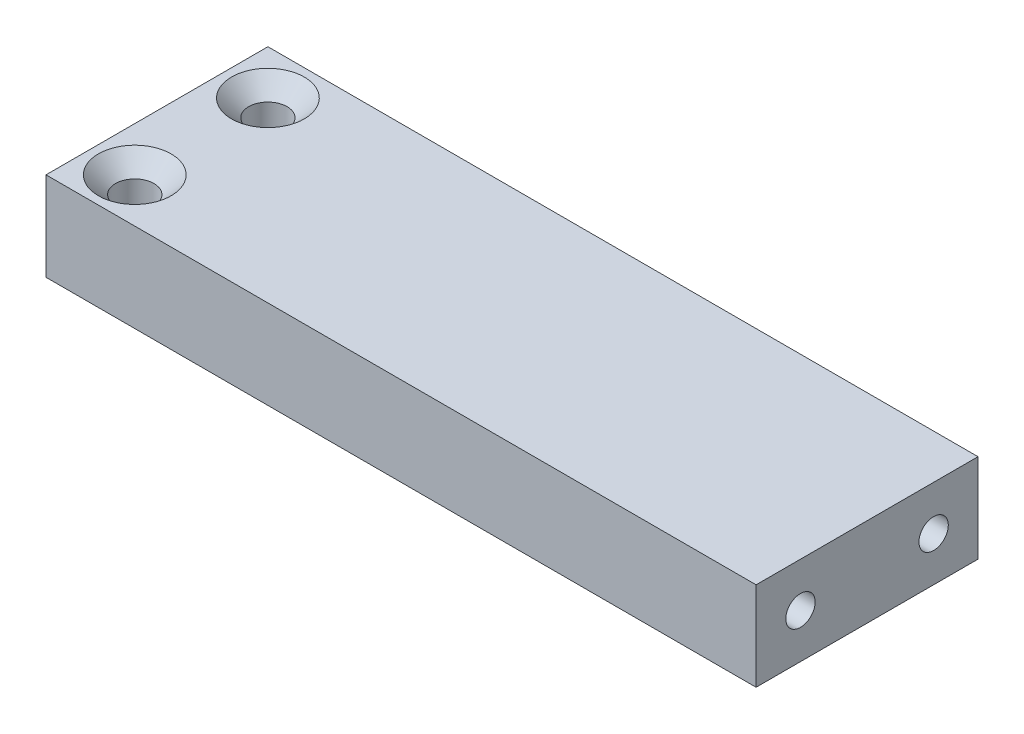
ISO-10303-21;
HEADER;
FILE_DESCRIPTION(('STEP AP214'),'2;1');
FILE_NAME('part.step','',(''),(''),'','','');
FILE_SCHEMA(('AUTOMOTIVE_DESIGN { 1 0 10303 214 1 1 1 1 }'));
ENDSEC;
DATA;
#1=APPLICATION_CONTEXT('core data for automotive mechanical design processes');
#2=APPLICATION_PROTOCOL_DEFINITION('international standard','automotive_design',2000,#1);
#3=PRODUCT_CONTEXT('',#1,'mechanical');
#4=PRODUCT('Part','Part','',(#3));
#5=PRODUCT_RELATED_PRODUCT_CATEGORY('part','',(#4));
#6=PRODUCT_DEFINITION_FORMATION('','',#4);
#7=PRODUCT_DEFINITION_CONTEXT('part definition',#1,'design');
#8=PRODUCT_DEFINITION('design','',#6,#7);
#9=PRODUCT_DEFINITION_SHAPE('','',#8);
#10=(LENGTH_UNIT() NAMED_UNIT(*) SI_UNIT(.MILLI.,.METRE.));
#11=(NAMED_UNIT(*) PLANE_ANGLE_UNIT() SI_UNIT($,.RADIAN.));
#12=(NAMED_UNIT(*) SI_UNIT($,.STERADIAN.) SOLID_ANGLE_UNIT());
#13=UNCERTAINTY_MEASURE_WITH_UNIT(LENGTH_MEASURE(1.E-05),#10,'distance_accuracy_value','');
#14=(GEOMETRIC_REPRESENTATION_CONTEXT(3) GLOBAL_UNCERTAINTY_ASSIGNED_CONTEXT((#13)) GLOBAL_UNIT_ASSIGNED_CONTEXT((#10,
#11,#12)) REPRESENTATION_CONTEXT('',''));
#15=CARTESIAN_POINT('',(0.,0.,0.));
#16=DIRECTION('',(0.,0.,1.));
#17=DIRECTION('',(1.,0.,0.));
#18=AXIS2_PLACEMENT_3D('',#15,#16,#17);
#19=CARTESIAN_POINT('',(0.,6.35,0.));
#20=DIRECTION('',(0.,-1.,0.));
#21=DIRECTION('',(0.,0.,-1.));
#22=AXIS2_PLACEMENT_3D('',#19,#20,#21);
#23=PLANE('',#22);
#24=CARTESIAN_POINT('',(-44.45,6.35,9.525));
#25=DIRECTION('',(0.,1.,0.));
#26=DIRECTION('',(0.,0.,1.));
#27=AXIS2_PLACEMENT_3D('',#24,#25,#26);
#28=CIRCLE('',#27,5.2);
#29=CARTESIAN_POINT('',(-44.45,6.35,14.725));
#30=VERTEX_POINT('',#29);
#31=EDGE_CURVE('E119',#30,#30,#28,.T.);
#32=ORIENTED_EDGE('',*,*,#31,.F.);
#33=EDGE_LOOP('',(#32));
#34=FACE_BOUND('',#33,.T.);
#35=DIRECTION('',(0.,0.,-1.));
#36=VECTOR('',#35,1.);
#37=CARTESIAN_POINT('',(-50.8,6.35,15.875));
#38=LINE('',#37,#36);
#39=CARTESIAN_POINT('',(-50.8,6.35,15.875));
#40=VERTEX_POINT('',#39);
#41=CARTESIAN_POINT('',(-50.8,6.35,-15.875));
#42=VERTEX_POINT('',#41);
#43=EDGE_CURVE('E141',#40,#42,#38,.T.);
#44=ORIENTED_EDGE('',*,*,#43,.F.);
#45=DIRECTION('',(1.,0.,0.));
#46=VECTOR('',#45,1.);
#47=CARTESIAN_POINT('',(-50.8,6.35,15.875));
#48=LINE('',#47,#46);
#49=CARTESIAN_POINT('',(50.8,6.35,15.875));
#50=VERTEX_POINT('',#49);
#51=EDGE_CURVE('E147',#40,#50,#48,.T.);
#52=ORIENTED_EDGE('',*,*,#51,.T.);
#53=DIRECTION('',(0.,0.,-1.));
#54=VECTOR('',#53,1.);
#55=CARTESIAN_POINT('',(50.8,6.35,15.875));
#56=LINE('',#55,#54);
#57=CARTESIAN_POINT('',(50.8,6.35,-15.875));
#58=VERTEX_POINT('',#57);
#59=EDGE_CURVE('E145',#50,#58,#56,.T.);
#60=ORIENTED_EDGE('',*,*,#59,.T.);
#61=DIRECTION('',(1.,0.,0.));
#62=VECTOR('',#61,1.);
#63=CARTESIAN_POINT('',(-50.8,6.35,-15.875));
#64=LINE('',#63,#62);
#65=EDGE_CURVE('E143',#42,#58,#64,.T.);
#66=ORIENTED_EDGE('',*,*,#65,.F.);
#67=EDGE_LOOP('',(#44,#52,#60,#66));
#68=FACE_BOUND('',#67,.T.);
#69=CARTESIAN_POINT('',(-44.45,6.35,-9.525));
#70=DIRECTION('',(0.,1.,0.));
#71=DIRECTION('',(0.,0.,1.));
#72=AXIS2_PLACEMENT_3D('',#69,#70,#71);
#73=CIRCLE('',#72,5.2);
#74=CARTESIAN_POINT('',(-44.45,6.35,-4.325));
#75=VERTEX_POINT('',#74);
#76=EDGE_CURVE('E112',#75,#75,#73,.T.);
#77=ORIENTED_EDGE('',*,*,#76,.F.);
#78=EDGE_LOOP('',(#77));
#79=FACE_BOUND('',#78,.T.);
#80=ADVANCED_FACE('F45',(#34,#68,#79),#23,.F.);
#81=CARTESIAN_POINT('',(-50.8,6.35,15.875));
#82=DIRECTION('',(-1.,0.,0.));
#83=DIRECTION('',(0.,0.,1.));
#84=AXIS2_PLACEMENT_3D('',#81,#82,#83);
#85=PLANE('',#84);
#86=DIRECTION('',(0.,0.,-1.));
#87=VECTOR('',#86,1.);
#88=CARTESIAN_POINT('',(-50.8,-6.35,15.875));
#89=LINE('',#88,#87);
#90=CARTESIAN_POINT('',(-50.8,-6.35,15.875));
#91=VERTEX_POINT('',#90);
#92=CARTESIAN_POINT('',(-50.8,-6.35,-15.875));
#93=VERTEX_POINT('',#92);
#94=EDGE_CURVE('E140',#91,#93,#89,.T.);
#95=ORIENTED_EDGE('',*,*,#94,.F.);
#96=DIRECTION('',(0.,-1.,0.));
#97=VECTOR('',#96,1.);
#98=CARTESIAN_POINT('',(-50.8,6.35,15.875));
#99=LINE('',#98,#97);
#100=EDGE_CURVE('E11',#40,#91,#99,.T.);
#101=ORIENTED_EDGE('',*,*,#100,.F.);
#102=ORIENTED_EDGE('',*,*,#43,.T.);
#103=DIRECTION('',(0.,-1.,0.));
#104=VECTOR('',#103,1.);
#105=CARTESIAN_POINT('',(-50.8,6.35,-15.875));
#106=LINE('',#105,#104);
#107=EDGE_CURVE('E49',#42,#93,#106,.T.);
#108=ORIENTED_EDGE('',*,*,#107,.T.);
#109=EDGE_LOOP('',(#95,#101,#102,#108));
#110=FACE_BOUND('',#109,.T.);
#111=ADVANCED_FACE('F47',(#110),#85,.T.);
#112=CARTESIAN_POINT('',(-50.8,6.35,15.875));
#113=DIRECTION('',(0.,0.,-1.));
#114=DIRECTION('',(-1.,0.,0.));
#115=AXIS2_PLACEMENT_3D('',#112,#113,#114);
#116=PLANE('',#115);
#117=DIRECTION('',(1.,0.,0.));
#118=VECTOR('',#117,1.);
#119=CARTESIAN_POINT('',(-50.8,-6.35,15.875));
#120=LINE('',#119,#118);
#121=CARTESIAN_POINT('',(50.8,-6.35,15.875));
#122=VERTEX_POINT('',#121);
#123=EDGE_CURVE('E80',#91,#122,#120,.T.);
#124=ORIENTED_EDGE('',*,*,#123,.T.);
#125=DIRECTION('',(0.,-1.,0.));
#126=VECTOR('',#125,1.);
#127=CARTESIAN_POINT('',(50.8,6.35,15.875));
#128=LINE('',#127,#126);
#129=EDGE_CURVE('E55',#50,#122,#128,.T.);
#130=ORIENTED_EDGE('',*,*,#129,.F.);
#131=ORIENTED_EDGE('',*,*,#51,.F.);
#132=ORIENTED_EDGE('',*,*,#100,.T.);
#133=EDGE_LOOP('',(#124,#130,#131,#132));
#134=FACE_BOUND('',#133,.T.);
#135=ADVANCED_FACE('F168',(#134),#116,.F.);
#136=CARTESIAN_POINT('',(50.8,6.35,15.875));
#137=DIRECTION('',(-1.,0.,0.));
#138=DIRECTION('',(0.,0.,1.));
#139=AXIS2_PLACEMENT_3D('',#136,#137,#138);
#140=PLANE('',#139);
#141=CARTESIAN_POINT('',(50.8,0.,9.52499999999998));
#142=DIRECTION('',(1.,0.,0.));
#143=DIRECTION('',(0.,0.,-1.));
#144=AXIS2_PLACEMENT_3D('',#141,#142,#143);
#145=CIRCLE('',#144,2.09999999999999);
#146=CARTESIAN_POINT('',(50.8,0.,7.42499999999999));
#147=VERTEX_POINT('',#146);
#148=EDGE_CURVE('E128',#147,#147,#145,.T.);
#149=ORIENTED_EDGE('',*,*,#148,.F.);
#150=EDGE_LOOP('',(#149));
#151=FACE_BOUND('',#150,.T.);
#152=CARTESIAN_POINT('',(50.8,0.,-9.52500000000002));
#153=DIRECTION('',(1.,0.,0.));
#154=DIRECTION('',(0.,0.,-1.));
#155=AXIS2_PLACEMENT_3D('',#152,#153,#154);
#156=CIRCLE('',#155,2.09999999999999);
#157=CARTESIAN_POINT('',(50.8,0.,-11.625));
#158=VERTEX_POINT('',#157);
#159=EDGE_CURVE('E134',#158,#158,#156,.T.);
#160=ORIENTED_EDGE('',*,*,#159,.F.);
#161=EDGE_LOOP('',(#160));
#162=FACE_BOUND('',#161,.T.);
#163=DIRECTION('',(0.,0.,-1.));
#164=VECTOR('',#163,1.);
#165=CARTESIAN_POINT('',(50.8,-6.35,15.875));
#166=LINE('',#165,#164);
#167=CARTESIAN_POINT('',(50.8,-6.35,-15.875));
#168=VERTEX_POINT('',#167);
#169=EDGE_CURVE('E154',#122,#168,#166,.T.);
#170=ORIENTED_EDGE('',*,*,#169,.T.);
#171=DIRECTION('',(0.,-1.,0.));
#172=VECTOR('',#171,1.);
#173=CARTESIAN_POINT('',(50.8,6.35,-15.875));
#174=LINE('',#173,#172);
#175=EDGE_CURVE('E158',#58,#168,#174,.T.);
#176=ORIENTED_EDGE('',*,*,#175,.F.);
#177=ORIENTED_EDGE('',*,*,#59,.F.);
#178=ORIENTED_EDGE('',*,*,#129,.T.);
#179=EDGE_LOOP('',(#170,#176,#177,#178));
#180=FACE_BOUND('',#179,.T.);
#181=ADVANCED_FACE('F166',(#151,#162,#180),#140,.F.);
#182=CARTESIAN_POINT('',(-50.8,6.35,-15.875));
#183=DIRECTION('',(0.,0.,-1.));
#184=DIRECTION('',(-1.,0.,0.));
#185=AXIS2_PLACEMENT_3D('',#182,#183,#184);
#186=PLANE('',#185);
#187=DIRECTION('',(1.,0.,0.));
#188=VECTOR('',#187,1.);
#189=CARTESIAN_POINT('',(-50.8,-6.35,-15.875));
#190=LINE('',#189,#188);
#191=EDGE_CURVE('E151',#93,#168,#190,.T.);
#192=ORIENTED_EDGE('',*,*,#191,.F.);
#193=ORIENTED_EDGE('',*,*,#107,.F.);
#194=ORIENTED_EDGE('',*,*,#65,.T.);
#195=ORIENTED_EDGE('',*,*,#175,.T.);
#196=EDGE_LOOP('',(#192,#193,#194,#195));
#197=FACE_BOUND('',#196,.T.);
#198=ADVANCED_FACE('F161',(#197),#186,.T.);
#199=CARTESIAN_POINT('',(0.,-6.35,0.));
#200=DIRECTION('',(0.,-1.,0.));
#201=DIRECTION('',(0.,0.,-1.));
#202=AXIS2_PLACEMENT_3D('',#199,#200,#201);
#203=PLANE('',#202);
#204=ORIENTED_EDGE('',*,*,#94,.T.);
#205=ORIENTED_EDGE('',*,*,#191,.T.);
#206=ORIENTED_EDGE('',*,*,#169,.F.);
#207=ORIENTED_EDGE('',*,*,#123,.F.);
#208=EDGE_LOOP('',(#204,#205,#206,#207));
#209=FACE_BOUND('',#208,.T.);
#210=ADVANCED_FACE('F164',(#209),#203,.T.);
#211=CARTESIAN_POINT('',(39.8698072999579,0.,-9.52500000000002));
#212=DIRECTION('',(1.,0.,0.));
#213=DIRECTION('',(0.,0.,-1.));
#214=AXIS2_PLACEMENT_3D('',#211,#212,#213);
#215=CONICAL_SURFACE('',#214,2.1,1.02974425867665);
#216=CARTESIAN_POINT('',(38.608,0.,-9.52500000000002));
#217=VERTEX_POINT('',#216);
#218=VERTEX_LOOP('',#217);
#219=FACE_BOUND('',#218,.T.);
#220=CARTESIAN_POINT('',(39.8698072999579,0.,-9.52500000000002));
#221=DIRECTION('',(1.,0.,0.));
#222=DIRECTION('',(0.,0.,-1.));
#223=AXIS2_PLACEMENT_3D('',#220,#221,#222);
#224=CIRCLE('',#223,2.1);
#225=CARTESIAN_POINT('',(39.8698072999579,0.,-11.625));
#226=VERTEX_POINT('',#225);
#227=EDGE_CURVE('E137',#226,#226,#224,.T.);
#228=ORIENTED_EDGE('',*,*,#227,.T.);
#229=EDGE_LOOP('',(#228));
#230=FACE_BOUND('',#229,.T.);
#231=ADVANCED_FACE('F203',(#219,#230),#215,.F.);
#232=CARTESIAN_POINT('',(50.8,0.,-9.52500000000002));
#233=DIRECTION('',(1.,0.,0.));
#234=DIRECTION('',(0.,0.,-1.));
#235=AXIS2_PLACEMENT_3D('',#232,#233,#234);
#236=CYLINDRICAL_SURFACE('',#235,2.09999999999999);
#237=ORIENTED_EDGE('',*,*,#227,.F.);
#238=EDGE_LOOP('',(#237));
#239=FACE_BOUND('',#238,.T.);
#240=ORIENTED_EDGE('',*,*,#159,.T.);
#241=EDGE_LOOP('',(#240));
#242=FACE_BOUND('',#241,.T.);
#243=ADVANCED_FACE('F199',(#239,#242),#236,.F.);
#244=CARTESIAN_POINT('',(39.8698072999579,0.,9.52499999999998));
#245=DIRECTION('',(1.,0.,0.));
#246=DIRECTION('',(0.,0.,-1.));
#247=AXIS2_PLACEMENT_3D('',#244,#245,#246);
#248=CONICAL_SURFACE('',#247,2.1,1.02974425867665);
#249=CARTESIAN_POINT('',(38.608,0.,9.52499999999998));
#250=VERTEX_POINT('',#249);
#251=VERTEX_LOOP('',#250);
#252=FACE_BOUND('',#251,.T.);
#253=CARTESIAN_POINT('',(39.8698072999579,0.,9.52499999999998));
#254=DIRECTION('',(1.,0.,0.));
#255=DIRECTION('',(0.,0.,-1.));
#256=AXIS2_PLACEMENT_3D('',#253,#254,#255);
#257=CIRCLE('',#256,2.1);
#258=CARTESIAN_POINT('',(39.8698072999579,0.,7.42499999999998));
#259=VERTEX_POINT('',#258);
#260=EDGE_CURVE('E131',#259,#259,#257,.T.);
#261=ORIENTED_EDGE('',*,*,#260,.T.);
#262=EDGE_LOOP('',(#261));
#263=FACE_BOUND('',#262,.T.);
#264=ADVANCED_FACE('F195',(#252,#263),#248,.F.);
#265=CARTESIAN_POINT('',(50.8,0.,9.52499999999998));
#266=DIRECTION('',(1.,0.,0.));
#267=DIRECTION('',(0.,0.,-1.));
#268=AXIS2_PLACEMENT_3D('',#265,#266,#267);
#269=CYLINDRICAL_SURFACE('',#268,2.09999999999999);
#270=ORIENTED_EDGE('',*,*,#260,.F.);
#271=EDGE_LOOP('',(#270));
#272=FACE_BOUND('',#271,.T.);
#273=ORIENTED_EDGE('',*,*,#148,.T.);
#274=EDGE_LOOP('',(#273));
#275=FACE_BOUND('',#274,.T.);
#276=ADVANCED_FACE('F191',(#272,#275),#269,.F.);
#277=CARTESIAN_POINT('',(-44.45,-4.18963329767421,-9.525));
#278=DIRECTION('',(0.,1.,0.));
#279=DIRECTION('',(0.,0.,1.));
#280=AXIS2_PLACEMENT_3D('',#277,#278,#279);
#281=CONICAL_SURFACE('',#280,2.75,1.02974425867665);
#282=CARTESIAN_POINT('',(-44.45,-5.842,-9.525));
#283=VERTEX_POINT('',#282);
#284=VERTEX_LOOP('',#283);
#285=FACE_BOUND('',#284,.T.);
#286=CARTESIAN_POINT('',(-44.45,-4.18963329767421,-9.525));
#287=DIRECTION('',(0.,1.,0.));
#288=DIRECTION('',(0.,0.,1.));
#289=AXIS2_PLACEMENT_3D('',#286,#287,#288);
#290=CIRCLE('',#289,2.75);
#291=CARTESIAN_POINT('',(-44.45,-4.18963329767421,-6.775));
#292=VERTEX_POINT('',#291);
#293=EDGE_CURVE('E125',#292,#292,#290,.T.);
#294=ORIENTED_EDGE('',*,*,#293,.T.);
#295=EDGE_LOOP('',(#294));
#296=FACE_BOUND('',#295,.T.);
#297=ADVANCED_FACE('F183',(#285,#296),#281,.F.);
#298=CARTESIAN_POINT('',(-44.45,6.35,-9.525));
#299=DIRECTION('',(0.,1.,0.));
#300=DIRECTION('',(0.,0.,1.));
#301=AXIS2_PLACEMENT_3D('',#298,#299,#300);
#302=CYLINDRICAL_SURFACE('',#301,2.75);
#303=ORIENTED_EDGE('',*,*,#293,.F.);
#304=EDGE_LOOP('',(#303));
#305=FACE_BOUND('',#304,.T.);
#306=CARTESIAN_POINT('',(-44.45,3.9,-9.525));
#307=DIRECTION('',(0.,1.,0.));
#308=DIRECTION('',(0.,0.,1.));
#309=AXIS2_PLACEMENT_3D('',#306,#307,#308);
#310=CIRCLE('',#309,2.75);
#311=CARTESIAN_POINT('',(-44.45,3.9,-6.775));
#312=VERTEX_POINT('',#311);
#313=EDGE_CURVE('E116',#312,#312,#310,.T.);
#314=ORIENTED_EDGE('',*,*,#313,.T.);
#315=EDGE_LOOP('',(#314));
#316=FACE_BOUND('',#315,.T.);
#317=ADVANCED_FACE('F177',(#305,#316),#302,.F.);
#318=CARTESIAN_POINT('',(-44.45,6.35,-9.525));
#319=DIRECTION('',(0.,1.,0.));
#320=DIRECTION('',(0.,0.,1.));
#321=AXIS2_PLACEMENT_3D('',#318,#319,#320);
#322=CONICAL_SURFACE('',#321,5.2,0.785398163397449);
#323=ORIENTED_EDGE('',*,*,#313,.F.);
#324=EDGE_LOOP('',(#323));
#325=FACE_BOUND('',#324,.T.);
#326=ORIENTED_EDGE('',*,*,#76,.T.);
#327=EDGE_LOOP('',(#326));
#328=FACE_BOUND('',#327,.T.);
#329=ADVANCED_FACE('F106',(#325,#328),#322,.F.);
#330=CARTESIAN_POINT('',(-44.45,-4.18963329767421,9.525));
#331=DIRECTION('',(0.,1.,0.));
#332=DIRECTION('',(0.,0.,1.));
#333=AXIS2_PLACEMENT_3D('',#330,#331,#332);
#334=CONICAL_SURFACE('',#333,2.75,1.02974425867665);
#335=CARTESIAN_POINT('',(-44.45,-5.842,9.525));
#336=VERTEX_POINT('',#335);
#337=VERTEX_LOOP('',#336);
#338=FACE_BOUND('',#337,.T.);
#339=CARTESIAN_POINT('',(-44.45,-4.18963329767421,9.525));
#340=DIRECTION('',(0.,1.,0.));
#341=DIRECTION('',(0.,0.,1.));
#342=AXIS2_PLACEMENT_3D('',#339,#340,#341);
#343=CIRCLE('',#342,2.75);
#344=CARTESIAN_POINT('',(-44.45,-4.18963329767421,12.275));
#345=VERTEX_POINT('',#344);
#346=EDGE_CURVE('E110',#345,#345,#343,.T.);
#347=ORIENTED_EDGE('',*,*,#346,.T.);
#348=EDGE_LOOP('',(#347));
#349=FACE_BOUND('',#348,.T.);
#350=ADVANCED_FACE('F102',(#338,#349),#334,.F.);
#351=CARTESIAN_POINT('',(-44.45,6.35,9.525));
#352=DIRECTION('',(0.,1.,0.));
#353=DIRECTION('',(0.,0.,1.));
#354=AXIS2_PLACEMENT_3D('',#351,#352,#353);
#355=CYLINDRICAL_SURFACE('',#354,2.75);
#356=ORIENTED_EDGE('',*,*,#346,.F.);
#357=EDGE_LOOP('',(#356));
#358=FACE_BOUND('',#357,.T.);
#359=CARTESIAN_POINT('',(-44.45,3.9,9.525));
#360=DIRECTION('',(0.,1.,0.));
#361=DIRECTION('',(0.,0.,1.));
#362=AXIS2_PLACEMENT_3D('',#359,#360,#361);
#363=CIRCLE('',#362,2.75);
#364=CARTESIAN_POINT('',(-44.45,3.9,12.275));
#365=VERTEX_POINT('',#364);
#366=EDGE_CURVE('E113',#365,#365,#363,.T.);
#367=ORIENTED_EDGE('',*,*,#366,.T.);
#368=EDGE_LOOP('',(#367));
#369=FACE_BOUND('',#368,.T.);
#370=ADVANCED_FACE('F105',(#358,#369),#355,.F.);
#371=CARTESIAN_POINT('',(-44.45,6.35,9.525));
#372=DIRECTION('',(0.,1.,0.));
#373=DIRECTION('',(0.,0.,1.));
#374=AXIS2_PLACEMENT_3D('',#371,#372,#373);
#375=CONICAL_SURFACE('',#374,5.2,0.785398163397449);
#376=ORIENTED_EDGE('',*,*,#366,.F.);
#377=EDGE_LOOP('',(#376));
#378=FACE_BOUND('',#377,.T.);
#379=ORIENTED_EDGE('',*,*,#31,.T.);
#380=EDGE_LOOP('',(#379));
#381=FACE_BOUND('',#380,.T.);
#382=ADVANCED_FACE('F278',(#378,#381),#375,.F.);
#383=CLOSED_SHELL('',(#80,#111,#135,#181,#198,#210,#231,#243,#264,#276,#297,#317,#329,#350,#370,#382));
#384=MANIFOLD_SOLID_BREP('B2',#383);
#385=ADVANCED_BREP_SHAPE_REPRESENTATION('',(#18,#384),#14);
#386=SHAPE_DEFINITION_REPRESENTATION(#9,#385);
ENDSEC;
END-ISO-10303-21;
